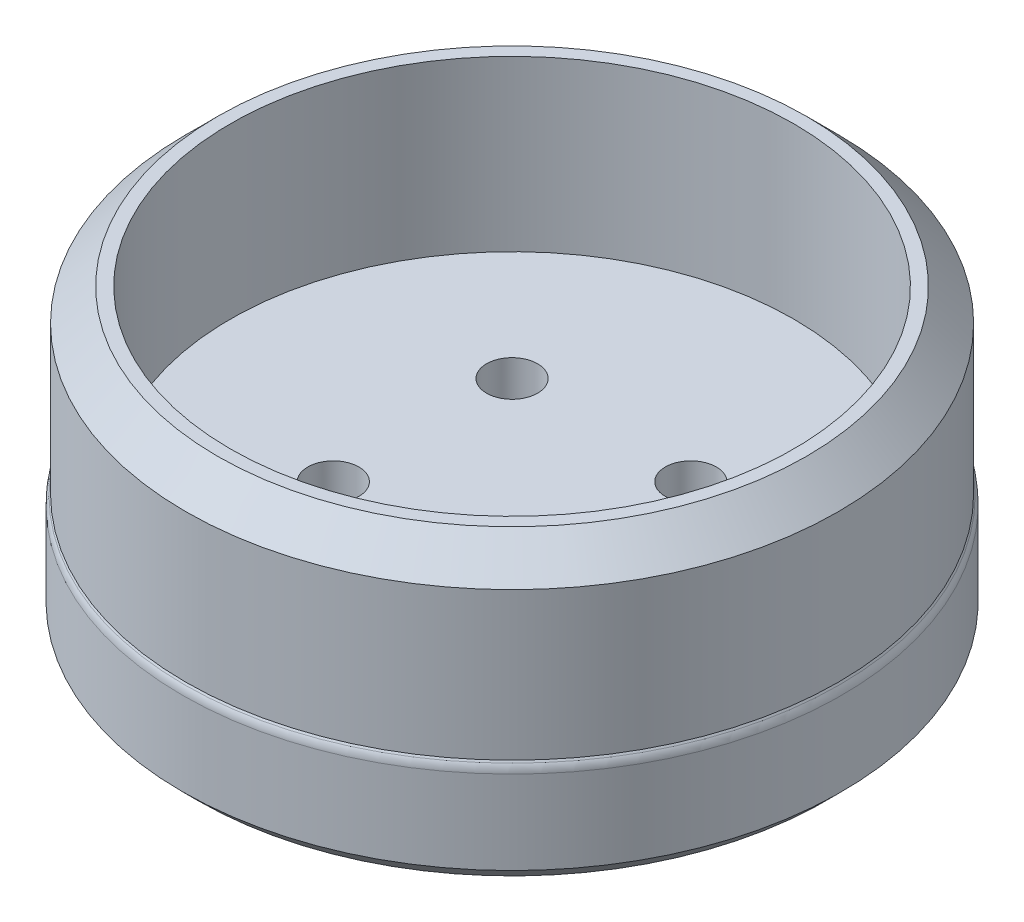
ISO-10303-21;
HEADER;
FILE_DESCRIPTION(('STEP AP214'),'2;1');
FILE_NAME('part.step','',(''),(''),'','','');
FILE_SCHEMA(('AUTOMOTIVE_DESIGN { 1 0 10303 214 1 1 1 1 }'));
ENDSEC;
DATA;
#1=APPLICATION_CONTEXT('core data for automotive mechanical design processes');
#2=APPLICATION_PROTOCOL_DEFINITION('international standard','automotive_design',2000,#1);
#3=PRODUCT_CONTEXT('',#1,'mechanical');
#4=PRODUCT('Part','Part','',(#3));
#5=PRODUCT_RELATED_PRODUCT_CATEGORY('part','',(#4));
#6=PRODUCT_DEFINITION_FORMATION('','',#4);
#7=PRODUCT_DEFINITION_CONTEXT('part definition',#1,'design');
#8=PRODUCT_DEFINITION('design','',#6,#7);
#9=PRODUCT_DEFINITION_SHAPE('','',#8);
#10=(LENGTH_UNIT() NAMED_UNIT(*) SI_UNIT(.MILLI.,.METRE.));
#11=(NAMED_UNIT(*) PLANE_ANGLE_UNIT() SI_UNIT($,.RADIAN.));
#12=(NAMED_UNIT(*) SI_UNIT($,.STERADIAN.) SOLID_ANGLE_UNIT());
#13=UNCERTAINTY_MEASURE_WITH_UNIT(LENGTH_MEASURE(1.E-05),#10,'distance_accuracy_value','');
#14=(GEOMETRIC_REPRESENTATION_CONTEXT(3) GLOBAL_UNCERTAINTY_ASSIGNED_CONTEXT((#13)) GLOBAL_UNIT_ASSIGNED_CONTEXT((#10,
#11,#12)) REPRESENTATION_CONTEXT('',''));
#15=CARTESIAN_POINT('',(0.,0.,0.));
#16=DIRECTION('',(0.,0.,1.));
#17=DIRECTION('',(1.,0.,0.));
#18=AXIS2_PLACEMENT_3D('',#15,#16,#17);
#19=CARTESIAN_POINT('',(-5.6,12.5,5.6));
#20=DIRECTION('',(0.,-1.,0.));
#21=DIRECTION('',(0.,0.,-1.));
#22=AXIS2_PLACEMENT_3D('',#19,#20,#21);
#23=CYLINDRICAL_SURFACE('',#22,1.6);
#24=CARTESIAN_POINT('',(-5.6,6.5,5.6));
#25=DIRECTION('',(0.,1.,0.));
#26=DIRECTION('',(0.,0.,1.));
#27=AXIS2_PLACEMENT_3D('',#24,#25,#26);
#28=CIRCLE('',#27,1.6);
#29=CARTESIAN_POINT('',(-5.6,6.5,7.2));
#30=VERTEX_POINT('',#29);
#31=EDGE_CURVE('E85',#30,#30,#28,.T.);
#32=ORIENTED_EDGE('',*,*,#31,.T.);
#33=EDGE_LOOP('',(#32));
#34=FACE_BOUND('',#33,.T.);
#35=CARTESIAN_POINT('',(-5.6,1.,5.6));
#36=DIRECTION('',(0.,-1.,0.));
#37=DIRECTION('',(0.,0.,-1.));
#38=AXIS2_PLACEMENT_3D('',#35,#36,#37);
#39=CIRCLE('',#38,1.6);
#40=CARTESIAN_POINT('',(-5.6,1.,4.));
#41=VERTEX_POINT('',#40);
#42=EDGE_CURVE('E81',#41,#41,#39,.F.);
#43=ORIENTED_EDGE('',*,*,#42,.F.);
#44=EDGE_LOOP('',(#43));
#45=FACE_BOUND('',#44,.T.);
#46=ADVANCED_FACE('F43',(#34,#45),#23,.F.);
#47=CARTESIAN_POINT('',(-5.59999999999962,12.5,-5.6));
#48=DIRECTION('',(0.,-1.,0.));
#49=DIRECTION('',(0.,0.,-1.));
#50=AXIS2_PLACEMENT_3D('',#47,#48,#49);
#51=CYLINDRICAL_SURFACE('',#50,1.6);
#52=CARTESIAN_POINT('',(-5.59999999999962,6.5,-5.6));
#53=DIRECTION('',(0.,1.,0.));
#54=DIRECTION('',(0.,0.,1.));
#55=AXIS2_PLACEMENT_3D('',#52,#53,#54);
#56=CIRCLE('',#55,1.6);
#57=CARTESIAN_POINT('',(-5.59999999999962,6.5,-4.));
#58=VERTEX_POINT('',#57);
#59=EDGE_CURVE('E108',#58,#58,#56,.T.);
#60=ORIENTED_EDGE('',*,*,#59,.T.);
#61=EDGE_LOOP('',(#60));
#62=FACE_BOUND('',#61,.T.);
#63=CARTESIAN_POINT('',(-5.59999999999962,1.,-5.6));
#64=DIRECTION('',(0.,-1.,0.));
#65=DIRECTION('',(0.,0.,-1.));
#66=AXIS2_PLACEMENT_3D('',#63,#64,#65);
#67=CIRCLE('',#66,1.6);
#68=CARTESIAN_POINT('',(-5.59999999999962,1.,-7.2));
#69=VERTEX_POINT('',#68);
#70=EDGE_CURVE('E86',#69,#69,#67,.F.);
#71=ORIENTED_EDGE('',*,*,#70,.F.);
#72=EDGE_LOOP('',(#71));
#73=FACE_BOUND('',#72,.T.);
#74=ADVANCED_FACE('F188',(#62,#73),#51,.F.);
#75=CARTESIAN_POINT('',(5.60000000000038,12.5,-5.59999999999962));
#76=DIRECTION('',(0.,-1.,0.));
#77=DIRECTION('',(0.,0.,-1.));
#78=AXIS2_PLACEMENT_3D('',#75,#76,#77);
#79=CYLINDRICAL_SURFACE('',#78,1.6);
#80=CARTESIAN_POINT('',(5.60000000000038,6.5,-5.59999999999962));
#81=DIRECTION('',(0.,1.,0.));
#82=DIRECTION('',(0.,0.,1.));
#83=AXIS2_PLACEMENT_3D('',#80,#81,#82);
#84=CIRCLE('',#83,1.6);
#85=CARTESIAN_POINT('',(5.60000000000038,6.5,-3.99999999999962));
#86=VERTEX_POINT('',#85);
#87=EDGE_CURVE('E104',#86,#86,#84,.T.);
#88=ORIENTED_EDGE('',*,*,#87,.T.);
#89=EDGE_LOOP('',(#88));
#90=FACE_BOUND('',#89,.T.);
#91=CARTESIAN_POINT('',(5.60000000000038,1.,-5.59999999999962));
#92=DIRECTION('',(0.,-1.,0.));
#93=DIRECTION('',(0.,0.,-1.));
#94=AXIS2_PLACEMENT_3D('',#91,#92,#93);
#95=CIRCLE('',#94,1.6);
#96=CARTESIAN_POINT('',(5.60000000000038,1.,-7.19999999999962));
#97=VERTEX_POINT('',#96);
#98=EDGE_CURVE('E90',#97,#97,#95,.F.);
#99=ORIENTED_EDGE('',*,*,#98,.F.);
#100=EDGE_LOOP('',(#99));
#101=FACE_BOUND('',#100,.T.);
#102=ADVANCED_FACE('F194',(#90,#101),#79,.F.);
#103=CARTESIAN_POINT('',(5.6,12.5,5.60000000000038));
#104=DIRECTION('',(0.,-1.,0.));
#105=DIRECTION('',(0.,0.,-1.));
#106=AXIS2_PLACEMENT_3D('',#103,#104,#105);
#107=CYLINDRICAL_SURFACE('',#106,1.6);
#108=CARTESIAN_POINT('',(5.6,6.5,5.60000000000038));
#109=DIRECTION('',(0.,1.,0.));
#110=DIRECTION('',(0.,0.,1.));
#111=AXIS2_PLACEMENT_3D('',#108,#109,#110);
#112=CIRCLE('',#111,1.6);
#113=CARTESIAN_POINT('',(5.6,6.5,7.20000000000038));
#114=VERTEX_POINT('',#113);
#115=EDGE_CURVE('E99',#114,#114,#112,.T.);
#116=ORIENTED_EDGE('',*,*,#115,.T.);
#117=EDGE_LOOP('',(#116));
#118=FACE_BOUND('',#117,.T.);
#119=CARTESIAN_POINT('',(5.6,1.,5.60000000000038));
#120=DIRECTION('',(0.,-1.,0.));
#121=DIRECTION('',(0.,0.,-1.));
#122=AXIS2_PLACEMENT_3D('',#119,#120,#121);
#123=CIRCLE('',#122,1.6);
#124=CARTESIAN_POINT('',(5.6,1.,4.00000000000038));
#125=VERTEX_POINT('',#124);
#126=EDGE_CURVE('E94',#125,#125,#123,.F.);
#127=ORIENTED_EDGE('',*,*,#126,.F.);
#128=EDGE_LOOP('',(#127));
#129=FACE_BOUND('',#128,.T.);
#130=ADVANCED_FACE('F199',(#118,#129),#107,.F.);
#131=CARTESIAN_POINT('',(0.,-1.,0.));
#132=DIRECTION('',(0.,1.,0.));
#133=DIRECTION('',(0.,0.,1.));
#134=AXIS2_PLACEMENT_3D('',#131,#132,#133);
#135=CYLINDRICAL_SURFACE('',#134,20.65);
#136=CARTESIAN_POINT('',(0.,5.23205080756887,0.));
#137=DIRECTION('',(0.,1.,0.));
#138=DIRECTION('',(0.,0.,1.));
#139=AXIS2_PLACEMENT_3D('',#136,#137,#138);
#140=CIRCLE('',#139,20.65);
#141=CARTESIAN_POINT('',(0.,5.23205080756887,20.65));
#142=VERTEX_POINT('',#141);
#143=EDGE_CURVE('E62',#142,#142,#140,.F.);
#144=ORIENTED_EDGE('',*,*,#143,.T.);
#145=EDGE_LOOP('',(#144));
#146=FACE_BOUND('',#145,.T.);
#147=CARTESIAN_POINT('',(0.,0.,0.));
#148=DIRECTION('',(0.,1.,0.));
#149=DIRECTION('',(0.,0.,1.));
#150=AXIS2_PLACEMENT_3D('',#147,#148,#149);
#151=CIRCLE('',#150,20.65);
#152=CARTESIAN_POINT('',(0.,0.,20.65));
#153=VERTEX_POINT('',#152);
#154=EDGE_CURVE('E76',#153,#153,#151,.T.);
#155=ORIENTED_EDGE('',*,*,#154,.T.);
#156=EDGE_LOOP('',(#155));
#157=FACE_BOUND('',#156,.T.);
#158=ADVANCED_FACE('F167',(#146,#157),#135,.T.);
#159=CARTESIAN_POINT('',(0.,-1.,0.));
#160=DIRECTION('',(0.,1.,0.));
#161=DIRECTION('',(0.,0.,1.));
#162=AXIS2_PLACEMENT_3D('',#159,#160,#161);
#163=PLANE('',#162);
#164=CARTESIAN_POINT('',(0.,-1.,0.));
#165=DIRECTION('',(0.,1.,0.));
#166=DIRECTION('',(0.,0.,1.));
#167=AXIS2_PLACEMENT_3D('',#164,#165,#166);
#168=CIRCLE('',#167,19.65);
#169=CARTESIAN_POINT('',(0.,-1.,19.65));
#170=VERTEX_POINT('',#169);
#171=EDGE_CURVE('E72',#170,#170,#168,.F.);
#172=ORIENTED_EDGE('',*,*,#171,.T.);
#173=EDGE_LOOP('',(#172));
#174=FACE_BOUND('',#173,.T.);
#175=CARTESIAN_POINT('',(5.6,-1.,5.60000000000038));
#176=DIRECTION('',(0.,-1.,0.));
#177=DIRECTION('',(0.,0.,-1.));
#178=AXIS2_PLACEMENT_3D('',#175,#176,#177);
#179=CIRCLE('',#178,2.8);
#180=CARTESIAN_POINT('',(5.6,-1.,2.80000000000038));
#181=VERTEX_POINT('',#180);
#182=EDGE_CURVE('E129',#181,#181,#179,.T.);
#183=ORIENTED_EDGE('',*,*,#182,.F.);
#184=EDGE_LOOP('',(#183));
#185=FACE_BOUND('',#184,.T.);
#186=CARTESIAN_POINT('',(-5.6,-1.,5.6));
#187=DIRECTION('',(0.,-1.,0.));
#188=DIRECTION('',(0.,0.,-1.));
#189=AXIS2_PLACEMENT_3D('',#186,#187,#188);
#190=CIRCLE('',#189,2.8);
#191=CARTESIAN_POINT('',(-5.6,-1.,2.8));
#192=VERTEX_POINT('',#191);
#193=EDGE_CURVE('E137',#192,#192,#190,.T.);
#194=ORIENTED_EDGE('',*,*,#193,.F.);
#195=EDGE_LOOP('',(#194));
#196=FACE_BOUND('',#195,.T.);
#197=CARTESIAN_POINT('',(-5.59999999999962,-1.,-5.6));
#198=DIRECTION('',(0.,-1.,0.));
#199=DIRECTION('',(0.,0.,-1.));
#200=AXIS2_PLACEMENT_3D('',#197,#198,#199);
#201=CIRCLE('',#200,2.8);
#202=CARTESIAN_POINT('',(-5.59999999999962,-1.,-8.4));
#203=VERTEX_POINT('',#202);
#204=EDGE_CURVE('E145',#203,#203,#201,.T.);
#205=ORIENTED_EDGE('',*,*,#204,.F.);
#206=EDGE_LOOP('',(#205));
#207=FACE_BOUND('',#206,.T.);
#208=CARTESIAN_POINT('',(5.60000000000038,-1.,-5.59999999999962));
#209=DIRECTION('',(0.,-1.,0.));
#210=DIRECTION('',(0.,0.,-1.));
#211=AXIS2_PLACEMENT_3D('',#208,#209,#210);
#212=CIRCLE('',#211,2.8);
#213=CARTESIAN_POINT('',(5.60000000000038,-1.,-8.39999999999962));
#214=VERTEX_POINT('',#213);
#215=EDGE_CURVE('E121',#214,#214,#212,.T.);
#216=ORIENTED_EDGE('',*,*,#215,.F.);
#217=EDGE_LOOP('',(#216));
#218=FACE_BOUND('',#217,.T.);
#219=ADVANCED_FACE('F163',(#174,#185,#196,#207,#218),#163,.F.);
#220=CARTESIAN_POINT('',(0.,17.1,0.));
#221=DIRECTION('',(0.,1.,0.));
#222=DIRECTION('',(0.,0.,1.));
#223=AXIS2_PLACEMENT_3D('',#220,#221,#222);
#224=PLANE('',#223);
#225=CARTESIAN_POINT('',(0.,17.1,0.));
#226=DIRECTION('',(0.,1.,0.));
#227=DIRECTION('',(0.,0.,1.));
#228=AXIS2_PLACEMENT_3D('',#225,#226,#227);
#229=CIRCLE('',#228,18.45);
#230=CARTESIAN_POINT('',(0.,17.1,18.45));
#231=VERTEX_POINT('',#230);
#232=EDGE_CURVE('E52',#231,#231,#229,.T.);
#233=ORIENTED_EDGE('',*,*,#232,.T.);
#234=EDGE_LOOP('',(#233));
#235=FACE_BOUND('',#234,.T.);
#236=CARTESIAN_POINT('',(0.,17.1,0.));
#237=DIRECTION('',(0.,1.,0.));
#238=DIRECTION('',(0.,0.,1.));
#239=AXIS2_PLACEMENT_3D('',#236,#237,#238);
#240=CIRCLE('',#239,17.65);
#241=CARTESIAN_POINT('',(0.,17.1,17.65));
#242=VERTEX_POINT('',#241);
#243=EDGE_CURVE('E103',#242,#242,#240,.T.);
#244=ORIENTED_EDGE('',*,*,#243,.F.);
#245=EDGE_LOOP('',(#244));
#246=FACE_BOUND('',#245,.T.);
#247=ADVANCED_FACE('F166',(#235,#246),#224,.T.);
#248=CARTESIAN_POINT('',(0.,17.1,0.));
#249=DIRECTION('',(0.,-1.,0.));
#250=DIRECTION('',(0.,0.,-1.));
#251=AXIS2_PLACEMENT_3D('',#248,#249,#250);
#252=CYLINDRICAL_SURFACE('',#251,20.45);
#253=CARTESIAN_POINT('',(0.,15.1,0.));
#254=DIRECTION('',(0.,1.,0.));
#255=DIRECTION('',(0.,0.,1.));
#256=AXIS2_PLACEMENT_3D('',#253,#254,#255);
#257=CIRCLE('',#256,20.45);
#258=CARTESIAN_POINT('',(0.,15.1,20.45));
#259=VERTEX_POINT('',#258);
#260=EDGE_CURVE('E10',#259,#259,#257,.F.);
#261=ORIENTED_EDGE('',*,*,#260,.T.);
#262=EDGE_LOOP('',(#261));
#263=FACE_BOUND('',#262,.T.);
#264=CARTESIAN_POINT('',(0.,5.84641016151376,0.));
#265=DIRECTION('',(0.,-1.,0.));
#266=DIRECTION('',(0.,0.,-1.));
#267=AXIS2_PLACEMENT_3D('',#264,#265,#266);
#268=CIRCLE('',#267,20.45);
#269=CARTESIAN_POINT('',(0.,5.84641016151376,-20.45));
#270=VERTEX_POINT('',#269);
#271=EDGE_CURVE('E68',#270,#270,#268,.F.);
#272=ORIENTED_EDGE('',*,*,#271,.T.);
#273=EDGE_LOOP('',(#272));
#274=FACE_BOUND('',#273,.T.);
#275=ADVANCED_FACE('F205',(#263,#274),#252,.T.);
#276=CARTESIAN_POINT('',(0.,17.1,0.));
#277=DIRECTION('',(0.,-1.,0.));
#278=DIRECTION('',(0.,0.,-1.));
#279=AXIS2_PLACEMENT_3D('',#276,#277,#278);
#280=CYLINDRICAL_SURFACE('',#279,17.65);
#281=ORIENTED_EDGE('',*,*,#243,.T.);
#282=EDGE_LOOP('',(#281));
#283=FACE_BOUND('',#282,.T.);
#284=CARTESIAN_POINT('',(0.,6.5,0.));
#285=DIRECTION('',(0.,1.,0.));
#286=DIRECTION('',(0.,0.,1.));
#287=AXIS2_PLACEMENT_3D('',#284,#285,#286);
#288=CIRCLE('',#287,17.65);
#289=CARTESIAN_POINT('',(0.,6.5,17.65));
#290=VERTEX_POINT('',#289);
#291=EDGE_CURVE('E80',#290,#290,#288,.F.);
#292=ORIENTED_EDGE('',*,*,#291,.T.);
#293=EDGE_LOOP('',(#292));
#294=FACE_BOUND('',#293,.T.);
#295=ADVANCED_FACE('F201',(#283,#294),#280,.F.);
#296=CARTESIAN_POINT('',(0.,6.5,0.));
#297=DIRECTION('',(0.,1.,0.));
#298=DIRECTION('',(0.,0.,1.));
#299=AXIS2_PLACEMENT_3D('',#296,#297,#298);
#300=PLANE('',#299);
#301=ORIENTED_EDGE('',*,*,#115,.F.);
#302=EDGE_LOOP('',(#301));
#303=FACE_BOUND('',#302,.T.);
#304=ORIENTED_EDGE('',*,*,#87,.F.);
#305=EDGE_LOOP('',(#304));
#306=FACE_BOUND('',#305,.T.);
#307=ORIENTED_EDGE('',*,*,#59,.F.);
#308=EDGE_LOOP('',(#307));
#309=FACE_BOUND('',#308,.T.);
#310=ORIENTED_EDGE('',*,*,#31,.F.);
#311=EDGE_LOOP('',(#310));
#312=FACE_BOUND('',#311,.T.);
#313=ORIENTED_EDGE('',*,*,#291,.F.);
#314=EDGE_LOOP('',(#313));
#315=FACE_BOUND('',#314,.T.);
#316=ADVANCED_FACE('F204',(#303,#306,#309,#312,#315),#300,.T.);
#317=CARTESIAN_POINT('',(5.6,1.,5.60000000000038));
#318=DIRECTION('',(0.,-1.,0.));
#319=DIRECTION('',(0.,0.,-1.));
#320=AXIS2_PLACEMENT_3D('',#317,#318,#319);
#321=PLANE('',#320);
#322=CARTESIAN_POINT('',(5.6,1.,5.60000000000038));
#323=DIRECTION('',(0.,-1.,0.));
#324=DIRECTION('',(0.,0.,-1.));
#325=AXIS2_PLACEMENT_3D('',#322,#323,#324);
#326=CIRCLE('',#325,2.8);
#327=CARTESIAN_POINT('',(5.6,1.,2.80000000000038));
#328=VERTEX_POINT('',#327);
#329=EDGE_CURVE('E133',#328,#328,#326,.T.);
#330=ORIENTED_EDGE('',*,*,#329,.T.);
#331=EDGE_LOOP('',(#330));
#332=FACE_BOUND('',#331,.T.);
#333=ORIENTED_EDGE('',*,*,#126,.T.);
#334=EDGE_LOOP('',(#333));
#335=FACE_BOUND('',#334,.T.);
#336=ADVANCED_FACE('F212',(#332,#335),#321,.T.);
#337=CARTESIAN_POINT('',(5.6,1.,5.60000000000038));
#338=DIRECTION('',(0.,-1.,0.));
#339=DIRECTION('',(0.,0.,-1.));
#340=AXIS2_PLACEMENT_3D('',#337,#338,#339);
#341=CYLINDRICAL_SURFACE('',#340,2.8);
#342=ORIENTED_EDGE('',*,*,#329,.F.);
#343=EDGE_LOOP('',(#342));
#344=FACE_BOUND('',#343,.T.);
#345=ORIENTED_EDGE('',*,*,#182,.T.);
#346=EDGE_LOOP('',(#345));
#347=FACE_BOUND('',#346,.T.);
#348=ADVANCED_FACE('F182',(#344,#347),#341,.F.);
#349=CARTESIAN_POINT('',(5.60000000000038,1.,-5.59999999999962));
#350=DIRECTION('',(0.,-1.,0.));
#351=DIRECTION('',(0.,0.,-1.));
#352=AXIS2_PLACEMENT_3D('',#349,#350,#351);
#353=PLANE('',#352);
#354=CARTESIAN_POINT('',(5.60000000000038,1.,-5.59999999999962));
#355=DIRECTION('',(0.,-1.,0.));
#356=DIRECTION('',(0.,0.,-1.));
#357=AXIS2_PLACEMENT_3D('',#354,#355,#356);
#358=CIRCLE('',#357,2.8);
#359=CARTESIAN_POINT('',(5.60000000000038,1.,-8.39999999999962));
#360=VERTEX_POINT('',#359);
#361=EDGE_CURVE('E98',#360,#360,#358,.T.);
#362=ORIENTED_EDGE('',*,*,#361,.T.);
#363=EDGE_LOOP('',(#362));
#364=FACE_BOUND('',#363,.T.);
#365=ORIENTED_EDGE('',*,*,#98,.T.);
#366=EDGE_LOOP('',(#365));
#367=FACE_BOUND('',#366,.T.);
#368=ADVANCED_FACE('F174',(#364,#367),#353,.T.);
#369=CARTESIAN_POINT('',(5.60000000000038,1.,-5.59999999999962));
#370=DIRECTION('',(0.,-1.,0.));
#371=DIRECTION('',(0.,0.,-1.));
#372=AXIS2_PLACEMENT_3D('',#369,#370,#371);
#373=CYLINDRICAL_SURFACE('',#372,2.8);
#374=ORIENTED_EDGE('',*,*,#361,.F.);
#375=EDGE_LOOP('',(#374));
#376=FACE_BOUND('',#375,.T.);
#377=ORIENTED_EDGE('',*,*,#215,.T.);
#378=EDGE_LOOP('',(#377));
#379=FACE_BOUND('',#378,.T.);
#380=ADVANCED_FACE('F172',(#376,#379),#373,.F.);
#381=CARTESIAN_POINT('',(-5.59999999999962,1.,-5.6));
#382=DIRECTION('',(0.,-1.,0.));
#383=DIRECTION('',(0.,0.,-1.));
#384=AXIS2_PLACEMENT_3D('',#381,#382,#383);
#385=PLANE('',#384);
#386=CARTESIAN_POINT('',(-5.59999999999962,1.,-5.6));
#387=DIRECTION('',(0.,-1.,0.));
#388=DIRECTION('',(0.,0.,-1.));
#389=AXIS2_PLACEMENT_3D('',#386,#387,#388);
#390=CIRCLE('',#389,2.8);
#391=CARTESIAN_POINT('',(-5.59999999999962,1.,-8.4));
#392=VERTEX_POINT('',#391);
#393=EDGE_CURVE('E125',#392,#392,#390,.T.);
#394=ORIENTED_EDGE('',*,*,#393,.T.);
#395=EDGE_LOOP('',(#394));
#396=FACE_BOUND('',#395,.T.);
#397=ORIENTED_EDGE('',*,*,#70,.T.);
#398=EDGE_LOOP('',(#397));
#399=FACE_BOUND('',#398,.T.);
#400=ADVANCED_FACE('F153',(#396,#399),#385,.T.);
#401=CARTESIAN_POINT('',(-5.59999999999962,1.,-5.6));
#402=DIRECTION('',(0.,-1.,0.));
#403=DIRECTION('',(0.,0.,-1.));
#404=AXIS2_PLACEMENT_3D('',#401,#402,#403);
#405=CYLINDRICAL_SURFACE('',#404,2.8);
#406=ORIENTED_EDGE('',*,*,#393,.F.);
#407=EDGE_LOOP('',(#406));
#408=FACE_BOUND('',#407,.T.);
#409=ORIENTED_EDGE('',*,*,#204,.T.);
#410=EDGE_LOOP('',(#409));
#411=FACE_BOUND('',#410,.T.);
#412=ADVANCED_FACE('F156',(#408,#411),#405,.F.);
#413=CARTESIAN_POINT('',(-5.6,1.,5.6));
#414=DIRECTION('',(0.,-1.,0.));
#415=DIRECTION('',(0.,0.,-1.));
#416=AXIS2_PLACEMENT_3D('',#413,#414,#415);
#417=PLANE('',#416);
#418=CARTESIAN_POINT('',(-5.6,1.,5.6));
#419=DIRECTION('',(0.,-1.,0.));
#420=DIRECTION('',(0.,0.,-1.));
#421=AXIS2_PLACEMENT_3D('',#418,#419,#420);
#422=CIRCLE('',#421,2.8);
#423=CARTESIAN_POINT('',(-5.6,1.,2.8));
#424=VERTEX_POINT('',#423);
#425=EDGE_CURVE('E141',#424,#424,#422,.T.);
#426=ORIENTED_EDGE('',*,*,#425,.T.);
#427=EDGE_LOOP('',(#426));
#428=FACE_BOUND('',#427,.T.);
#429=ORIENTED_EDGE('',*,*,#42,.T.);
#430=EDGE_LOOP('',(#429));
#431=FACE_BOUND('',#430,.T.);
#432=ADVANCED_FACE('F159',(#428,#431),#417,.T.);
#433=CARTESIAN_POINT('',(-5.6,1.,5.6));
#434=DIRECTION('',(0.,-1.,0.));
#435=DIRECTION('',(0.,0.,-1.));
#436=AXIS2_PLACEMENT_3D('',#433,#434,#435);
#437=CYLINDRICAL_SURFACE('',#436,2.8);
#438=ORIENTED_EDGE('',*,*,#425,.F.);
#439=EDGE_LOOP('',(#438));
#440=FACE_BOUND('',#439,.T.);
#441=ORIENTED_EDGE('',*,*,#193,.T.);
#442=EDGE_LOOP('',(#441));
#443=FACE_BOUND('',#442,.T.);
#444=ADVANCED_FACE('F226',(#440,#443),#437,.F.);
#445=CARTESIAN_POINT('',(0.,0.,0.));
#446=DIRECTION('',(0.,1.,0.));
#447=DIRECTION('',(0.,0.,1.));
#448=AXIS2_PLACEMENT_3D('',#445,#446,#447);
#449=CONICAL_SURFACE('',#448,20.65,0.78539816339745);
#450=ORIENTED_EDGE('',*,*,#171,.F.);
#451=EDGE_LOOP('',(#450));
#452=FACE_BOUND('',#451,.T.);
#453=ORIENTED_EDGE('',*,*,#154,.F.);
#454=EDGE_LOOP('',(#453));
#455=FACE_BOUND('',#454,.T.);
#456=ADVANCED_FACE('F219',(#452,#455),#449,.T.);
#457=CARTESIAN_POINT('',(0.,6.5,0.));
#458=DIRECTION('',(0.,-1.,0.));
#459=DIRECTION('',(0.,0.,-1.));
#460=AXIS2_PLACEMENT_3D('',#457,#458,#459);
#461=CONICAL_SURFACE('',#460,20.0726497308104,0.523598775598306);
#462=CARTESIAN_POINT('',(0.,5.73205080756887,0.));
#463=DIRECTION('',(0.,1.,0.));
#464=DIRECTION('',(0.,0.,1.));
#465=AXIS2_PLACEMENT_3D('',#462,#463,#464);
#466=CIRCLE('',#465,20.5160254037844);
#467=CARTESIAN_POINT('',(0.,5.73205080756887,20.5160254037844));
#468=VERTEX_POINT('',#467);
#469=EDGE_CURVE('E57',#468,#468,#466,.T.);
#470=ORIENTED_EDGE('',*,*,#469,.T.);
#471=EDGE_LOOP('',(#470));
#472=FACE_BOUND('',#471,.T.);
#473=ORIENTED_EDGE('',*,*,#271,.F.);
#474=EDGE_LOOP('',(#473));
#475=FACE_BOUND('',#474,.T.);
#476=ADVANCED_FACE('F225',(#472,#475),#461,.T.);
#477=CARTESIAN_POINT('',(0.,5.23205080756887,0.));
#478=DIRECTION('',(0.,1.,0.));
#479=DIRECTION('',(0.,0.,1.));
#480=AXIS2_PLACEMENT_3D('',#477,#478,#479);
#481=TOROIDAL_SURFACE('',#480,19.65,1.);
#482=ORIENTED_EDGE('',*,*,#469,.F.);
#483=EDGE_LOOP('',(#482));
#484=FACE_BOUND('',#483,.T.);
#485=ORIENTED_EDGE('',*,*,#143,.F.);
#486=EDGE_LOOP('',(#485));
#487=FACE_BOUND('',#486,.T.);
#488=ADVANCED_FACE('F231',(#484,#487),#481,.T.);
#489=CARTESIAN_POINT('',(0.,17.1,0.));
#490=DIRECTION('',(0.,-1.,0.));
#491=DIRECTION('',(0.,0.,-1.));
#492=AXIS2_PLACEMENT_3D('',#489,#490,#491);
#493=CONICAL_SURFACE('',#492,18.45,0.785398163397446);
#494=ORIENTED_EDGE('',*,*,#260,.F.);
#495=EDGE_LOOP('',(#494));
#496=FACE_BOUND('',#495,.T.);
#497=ORIENTED_EDGE('',*,*,#232,.F.);
#498=EDGE_LOOP('',(#497));
#499=FACE_BOUND('',#498,.T.);
#500=ADVANCED_FACE('F46',(#496,#499),#493,.T.);
#501=CLOSED_SHELL('',(#46,#74,#102,#130,#158,#219,#247,#275,#295,#316,#336,#348,#368,#380,#400,
#412,#432,#444,#456,#476,#488,#500));
#502=MANIFOLD_SOLID_BREP('B2',#501);
#503=ADVANCED_BREP_SHAPE_REPRESENTATION('',(#18,#502),#14);
#504=SHAPE_DEFINITION_REPRESENTATION(#9,#503);
ENDSEC;
END-ISO-10303-21;
